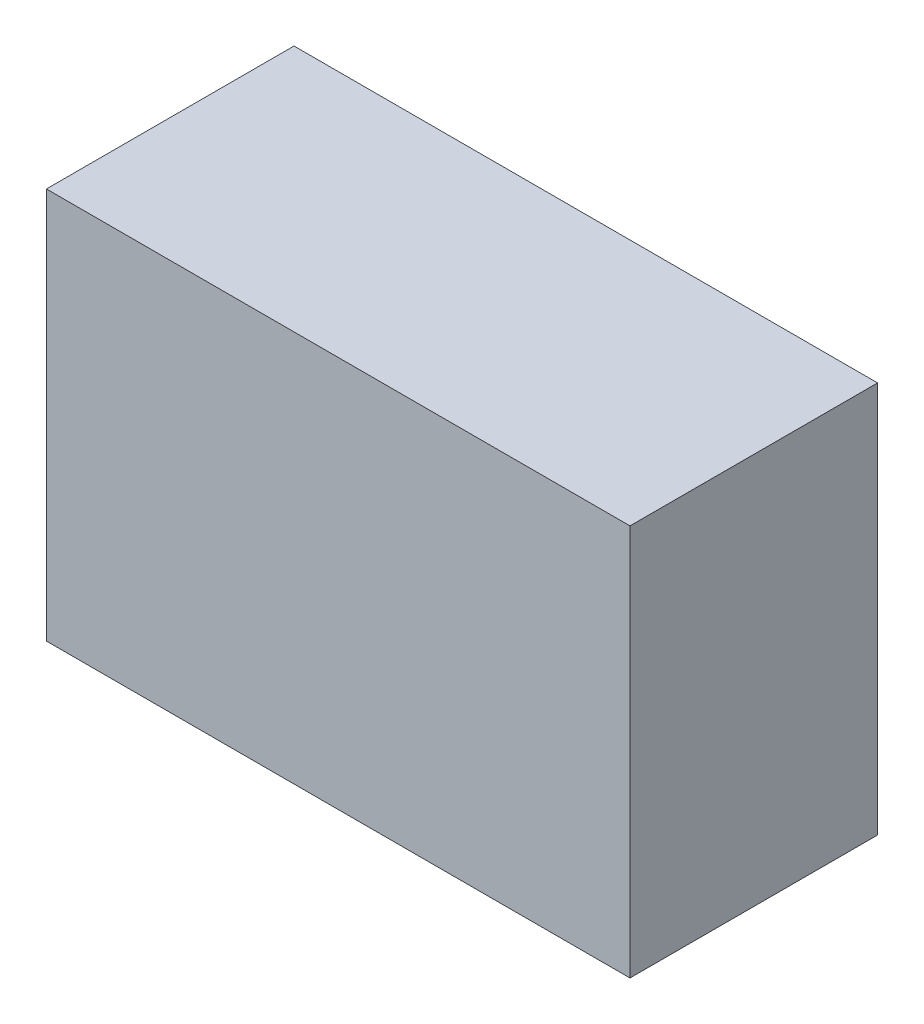
ISO-10303-21;
HEADER;
FILE_DESCRIPTION(('STEP AP214'),'2;1');
FILE_NAME('part.step','',(''),(''),'','','');
FILE_SCHEMA(('AUTOMOTIVE_DESIGN { 1 0 10303 214 1 1 1 1 }'));
ENDSEC;
DATA;
#1=APPLICATION_CONTEXT('core data for automotive mechanical design processes');
#2=APPLICATION_PROTOCOL_DEFINITION('international standard','automotive_design',2000,#1);
#3=PRODUCT_CONTEXT('',#1,'mechanical');
#4=PRODUCT('Part','Part','',(#3));
#5=PRODUCT_RELATED_PRODUCT_CATEGORY('part','',(#4));
#6=PRODUCT_DEFINITION_FORMATION('','',#4);
#7=PRODUCT_DEFINITION_CONTEXT('part definition',#1,'design');
#8=PRODUCT_DEFINITION('design','',#6,#7);
#9=PRODUCT_DEFINITION_SHAPE('','',#8);
#10=(LENGTH_UNIT() NAMED_UNIT(*) SI_UNIT(.MILLI.,.METRE.));
#11=(NAMED_UNIT(*) PLANE_ANGLE_UNIT() SI_UNIT($,.RADIAN.));
#12=(NAMED_UNIT(*) SI_UNIT($,.STERADIAN.) SOLID_ANGLE_UNIT());
#13=UNCERTAINTY_MEASURE_WITH_UNIT(LENGTH_MEASURE(1.E-05),#10,'distance_accuracy_value','');
#14=(GEOMETRIC_REPRESENTATION_CONTEXT(3) GLOBAL_UNCERTAINTY_ASSIGNED_CONTEXT((#13)) GLOBAL_UNIT_ASSIGNED_CONTEXT((#10,
#11,#12)) REPRESENTATION_CONTEXT('',''));
#15=CARTESIAN_POINT('',(0.,0.,0.));
#16=DIRECTION('',(0.,0.,1.));
#17=DIRECTION('',(1.,0.,0.));
#18=AXIS2_PLACEMENT_3D('',#15,#16,#17);
#19=CARTESIAN_POINT('',(17.293203129326,2.57555838043164,0.));
#20=DIRECTION('',(1.,0.,0.));
#21=DIRECTION('',(0.,1.,0.));
#22=AXIS2_PLACEMENT_3D('',#19,#20,#21);
#23=PLANE('',#22);
#24=DIRECTION('',(0.,1.,0.));
#25=VECTOR('',#24,1.);
#26=CARTESIAN_POINT('',(17.293203129326,1.78488693857008,0.));
#27=LINE('',#26,#25);
#28=CARTESIAN_POINT('',(17.293203129326,1.78488693857008,0.));
#29=VERTEX_POINT('',#28);
#30=CARTESIAN_POINT('',(17.293203129326,2.57555838043164,0.));
#31=VERTEX_POINT('',#30);
#32=EDGE_CURVE('E83',#29,#31,#27,.T.);
#33=ORIENTED_EDGE('',*,*,#32,.F.);
#34=DIRECTION('',(0.,0.,-1.));
#35=VECTOR('',#34,1.);
#36=CARTESIAN_POINT('',(17.293203129326,1.78488693857008,0.));
#37=LINE('',#36,#35);
#38=CARTESIAN_POINT('',(17.293203129326,1.78488693857008,-0.5));
#39=VERTEX_POINT('',#38);
#40=EDGE_CURVE('E20',#29,#39,#37,.T.);
#41=ORIENTED_EDGE('',*,*,#40,.T.);
#42=DIRECTION('',(0.,-1.,0.));
#43=VECTOR('',#42,1.);
#44=CARTESIAN_POINT('',(17.293203129326,1.78488693857008,-0.5));
#45=LINE('',#44,#43);
#46=CARTESIAN_POINT('',(17.293203129326,2.57555838043164,-0.5));
#47=VERTEX_POINT('',#46);
#48=EDGE_CURVE('E109',#47,#39,#45,.T.);
#49=ORIENTED_EDGE('',*,*,#48,.F.);
#50=DIRECTION('',(0.,0.,-1.));
#51=VECTOR('',#50,1.);
#52=CARTESIAN_POINT('',(17.293203129326,2.57555838043164,0.));
#53=LINE('',#52,#51);
#54=EDGE_CURVE('E11',#31,#47,#53,.T.);
#55=ORIENTED_EDGE('',*,*,#54,.F.);
#56=EDGE_LOOP('',(#33,#41,#49,#55));
#57=FACE_BOUND('',#56,.T.);
#58=ADVANCED_FACE('F16',(#57),#23,.T.);
#59=CARTESIAN_POINT('',(16.1147985765516,2.57555838043164,0.));
#60=DIRECTION('',(0.,1.,0.));
#61=DIRECTION('',(1.,0.,0.));
#62=AXIS2_PLACEMENT_3D('',#59,#60,#61);
#63=PLANE('',#62);
#64=DIRECTION('',(-1.,0.,0.));
#65=VECTOR('',#64,1.);
#66=CARTESIAN_POINT('',(17.293203129326,2.57555838043164,0.));
#67=LINE('',#66,#65);
#68=CARTESIAN_POINT('',(16.1147985765516,2.57555838043164,0.));
#69=VERTEX_POINT('',#68);
#70=EDGE_CURVE('E87',#31,#69,#67,.T.);
#71=ORIENTED_EDGE('',*,*,#70,.F.);
#72=ORIENTED_EDGE('',*,*,#54,.T.);
#73=DIRECTION('',(1.,0.,0.));
#74=VECTOR('',#73,1.);
#75=CARTESIAN_POINT('',(17.293203129326,2.57555838043164,-0.5));
#76=LINE('',#75,#74);
#77=CARTESIAN_POINT('',(16.1147985765516,2.57555838043164,-0.5));
#78=VERTEX_POINT('',#77);
#79=EDGE_CURVE('E102',#78,#47,#76,.T.);
#80=ORIENTED_EDGE('',*,*,#79,.F.);
#81=DIRECTION('',(0.,0.,-1.));
#82=VECTOR('',#81,1.);
#83=CARTESIAN_POINT('',(16.1147985765516,2.57555838043164,0.));
#84=LINE('',#83,#82);
#85=EDGE_CURVE('E27',#69,#78,#84,.T.);
#86=ORIENTED_EDGE('',*,*,#85,.F.);
#87=EDGE_LOOP('',(#71,#72,#80,#86));
#88=FACE_BOUND('',#87,.T.);
#89=ADVANCED_FACE('F125',(#88),#63,.T.);
#90=CARTESIAN_POINT('',(16.1147985765516,1.78488693857008,0.));
#91=DIRECTION('',(-1.,0.,0.));
#92=DIRECTION('',(0.,0.,1.));
#93=AXIS2_PLACEMENT_3D('',#90,#91,#92);
#94=PLANE('',#93);
#95=DIRECTION('',(0.,-1.,0.));
#96=VECTOR('',#95,1.);
#97=CARTESIAN_POINT('',(16.1147985765516,2.57555838043164,0.));
#98=LINE('',#97,#96);
#99=CARTESIAN_POINT('',(16.1147985765516,1.78488693857008,0.));
#100=VERTEX_POINT('',#99);
#101=EDGE_CURVE('E90',#69,#100,#98,.T.);
#102=ORIENTED_EDGE('',*,*,#101,.F.);
#103=ORIENTED_EDGE('',*,*,#85,.T.);
#104=DIRECTION('',(0.,1.,0.));
#105=VECTOR('',#104,1.);
#106=CARTESIAN_POINT('',(16.1147985765516,2.57555838043164,-0.5));
#107=LINE('',#106,#105);
#108=CARTESIAN_POINT('',(16.1147985765516,1.78488693857008,-0.5));
#109=VERTEX_POINT('',#108);
#110=EDGE_CURVE('E98',#109,#78,#107,.T.);
#111=ORIENTED_EDGE('',*,*,#110,.F.);
#112=DIRECTION('',(0.,0.,-1.));
#113=VECTOR('',#112,1.);
#114=CARTESIAN_POINT('',(16.1147985765516,1.78488693857008,0.));
#115=LINE('',#114,#113);
#116=EDGE_CURVE('E64',#100,#109,#115,.T.);
#117=ORIENTED_EDGE('',*,*,#116,.F.);
#118=EDGE_LOOP('',(#102,#103,#111,#117));
#119=FACE_BOUND('',#118,.T.);
#120=ADVANCED_FACE('F114',(#119),#94,.T.);
#121=CARTESIAN_POINT('',(17.293203129326,1.78488693857008,0.));
#122=DIRECTION('',(0.,-1.,0.));
#123=DIRECTION('',(0.,0.,-1.));
#124=AXIS2_PLACEMENT_3D('',#121,#122,#123);
#125=PLANE('',#124);
#126=DIRECTION('',(1.,0.,0.));
#127=VECTOR('',#126,1.);
#128=CARTESIAN_POINT('',(16.1147985765516,1.78488693857008,0.));
#129=LINE('',#128,#127);
#130=EDGE_CURVE('E76',#100,#29,#129,.T.);
#131=ORIENTED_EDGE('',*,*,#130,.F.);
#132=ORIENTED_EDGE('',*,*,#116,.T.);
#133=DIRECTION('',(-1.,0.,0.));
#134=VECTOR('',#133,1.);
#135=CARTESIAN_POINT('',(16.1147985765516,1.78488693857008,-0.5));
#136=LINE('',#135,#134);
#137=EDGE_CURVE('E78',#39,#109,#136,.T.);
#138=ORIENTED_EDGE('',*,*,#137,.F.);
#139=ORIENTED_EDGE('',*,*,#40,.F.);
#140=EDGE_LOOP('',(#131,#132,#138,#139));
#141=FACE_BOUND('',#140,.T.);
#142=ADVANCED_FACE('F18',(#141),#125,.T.);
#143=CARTESIAN_POINT('',(16.7040008529389,2.18022265950085,-0.5));
#144=DIRECTION('',(0.,0.,-1.));
#145=DIRECTION('',(0.,-1.,0.));
#146=AXIS2_PLACEMENT_3D('',#143,#144,#145);
#147=PLANE('',#146);
#148=ORIENTED_EDGE('',*,*,#137,.T.);
#149=ORIENTED_EDGE('',*,*,#110,.T.);
#150=ORIENTED_EDGE('',*,*,#79,.T.);
#151=ORIENTED_EDGE('',*,*,#48,.T.);
#152=EDGE_LOOP('',(#148,#149,#150,#151));
#153=FACE_BOUND('',#152,.T.);
#154=ADVANCED_FACE('F118',(#153),#147,.T.);
#155=CARTESIAN_POINT('',(16.7040008529389,2.18022265950085,0.));
#156=DIRECTION('',(0.,0.,-1.));
#157=DIRECTION('',(0.,-1.,0.));
#158=AXIS2_PLACEMENT_3D('',#155,#156,#157);
#159=PLANE('',#158);
#160=ORIENTED_EDGE('',*,*,#130,.T.);
#161=ORIENTED_EDGE('',*,*,#32,.T.);
#162=ORIENTED_EDGE('',*,*,#70,.T.);
#163=ORIENTED_EDGE('',*,*,#101,.T.);
#164=EDGE_LOOP('',(#160,#161,#162,#163));
#165=FACE_BOUND('',#164,.T.);
#166=ADVANCED_FACE('F89',(#165),#159,.F.);
#167=CLOSED_SHELL('',(#58,#89,#120,#142,#154,#166));
#168=MANIFOLD_SOLID_BREP('B1',#167);
#169=ADVANCED_BREP_SHAPE_REPRESENTATION('',(#18,#168),#14);
#170=SHAPE_DEFINITION_REPRESENTATION(#9,#169);
ENDSEC;
END-ISO-10303-21;
